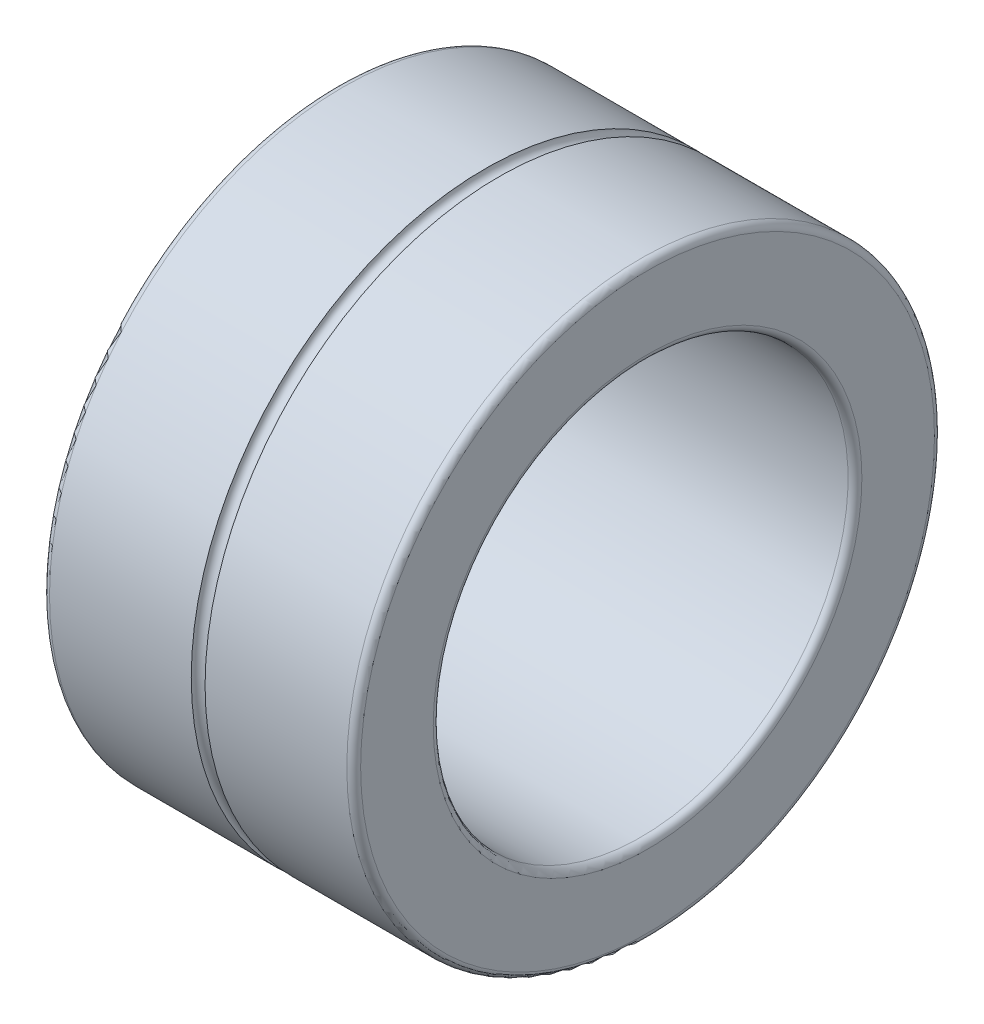
ISO-10303-21;
HEADER;
FILE_DESCRIPTION(('STEP AP214'),'2;1');
FILE_NAME('part.step','',(''),(''),'','','');
FILE_SCHEMA(('AUTOMOTIVE_DESIGN { 1 0 10303 214 1 1 1 1 }'));
ENDSEC;
DATA;
#1=APPLICATION_CONTEXT('core data for automotive mechanical design processes');
#2=APPLICATION_PROTOCOL_DEFINITION('international standard','automotive_design',2000,#1);
#3=PRODUCT_CONTEXT('',#1,'mechanical');
#4=PRODUCT('Part','Part','',(#3));
#5=PRODUCT_RELATED_PRODUCT_CATEGORY('part','',(#4));
#6=PRODUCT_DEFINITION_FORMATION('','',#4);
#7=PRODUCT_DEFINITION_CONTEXT('part definition',#1,'design');
#8=PRODUCT_DEFINITION('design','',#6,#7);
#9=PRODUCT_DEFINITION_SHAPE('','',#8);
#10=(LENGTH_UNIT() NAMED_UNIT(*) SI_UNIT(.MILLI.,.METRE.));
#11=(NAMED_UNIT(*) PLANE_ANGLE_UNIT() SI_UNIT($,.RADIAN.));
#12=(NAMED_UNIT(*) SI_UNIT($,.STERADIAN.) SOLID_ANGLE_UNIT());
#13=UNCERTAINTY_MEASURE_WITH_UNIT(LENGTH_MEASURE(1.E-05),#10,'distance_accuracy_value','');
#14=(GEOMETRIC_REPRESENTATION_CONTEXT(3) GLOBAL_UNCERTAINTY_ASSIGNED_CONTEXT((#13)) GLOBAL_UNIT_ASSIGNED_CONTEXT((#10,
#11,#12)) REPRESENTATION_CONTEXT('',''));
#15=CARTESIAN_POINT('',(0.,0.,0.));
#16=DIRECTION('',(0.,0.,1.));
#17=DIRECTION('',(1.,0.,0.));
#18=AXIS2_PLACEMENT_3D('',#15,#16,#17);
#19=CARTESIAN_POINT('',(0.,0.,0.));
#20=DIRECTION('',(-1.,0.,0.));
#21=DIRECTION('',(0.,0.,1.));
#22=AXIS2_PLACEMENT_3D('',#19,#20,#21);
#23=CYLINDRICAL_SURFACE('',#22,30.);
#24=CARTESIAN_POINT('',(1.,0.,0.));
#25=DIRECTION('',(1.,0.,0.));
#26=DIRECTION('',(0.,0.,-1.));
#27=AXIS2_PLACEMENT_3D('',#24,#25,#26);
#28=CIRCLE('',#27,30.);
#29=CARTESIAN_POINT('',(1.,0.,-30.));
#30=VERTEX_POINT('',#29);
#31=EDGE_CURVE('E57',#30,#30,#28,.F.);
#32=ORIENTED_EDGE('',*,*,#31,.T.);
#33=EDGE_LOOP('',(#32));
#34=FACE_BOUND('',#33,.T.);
#35=CARTESIAN_POINT('',(44.,0.,0.));
#36=DIRECTION('',(-1.,0.,0.));
#37=DIRECTION('',(0.,0.,1.));
#38=AXIS2_PLACEMENT_3D('',#35,#36,#37);
#39=CIRCLE('',#38,30.);
#40=CARTESIAN_POINT('',(44.,0.,30.));
#41=VERTEX_POINT('',#40);
#42=EDGE_CURVE('E60',#41,#41,#39,.F.);
#43=ORIENTED_EDGE('',*,*,#42,.T.);
#44=EDGE_LOOP('',(#43));
#45=FACE_BOUND('',#44,.T.);
#46=ADVANCED_FACE('F31',(#34,#45),#23,.F.);
#47=CARTESIAN_POINT('',(45.,42.5,0.));
#48=DIRECTION('',(-1.,0.,0.));
#49=DIRECTION('',(0.,0.,1.));
#50=AXIS2_PLACEMENT_3D('',#47,#48,#49);
#51=PLANE('',#50);
#52=CARTESIAN_POINT('',(45.,0.,0.));
#53=DIRECTION('',(-1.,0.,0.));
#54=DIRECTION('',(0.,0.,1.));
#55=AXIS2_PLACEMENT_3D('',#52,#53,#54);
#56=CIRCLE('',#55,41.5);
#57=CARTESIAN_POINT('',(45.,0.,41.5));
#58=VERTEX_POINT('',#57);
#59=EDGE_CURVE('E10',#58,#58,#56,.F.);
#60=ORIENTED_EDGE('',*,*,#59,.T.);
#61=EDGE_LOOP('',(#60));
#62=FACE_BOUND('',#61,.T.);
#63=CARTESIAN_POINT('',(45.,0.,0.));
#64=DIRECTION('',(-1.,0.,0.));
#65=DIRECTION('',(0.,0.,1.));
#66=AXIS2_PLACEMENT_3D('',#63,#64,#65);
#67=CIRCLE('',#66,31.);
#68=CARTESIAN_POINT('',(45.,0.,31.));
#69=VERTEX_POINT('',#68);
#70=EDGE_CURVE('E38',#69,#69,#67,.T.);
#71=ORIENTED_EDGE('',*,*,#70,.T.);
#72=EDGE_LOOP('',(#71));
#73=FACE_BOUND('',#72,.T.);
#74=ADVANCED_FACE('F80',(#62,#73),#51,.F.);
#75=CARTESIAN_POINT('',(0.,0.,0.));
#76=DIRECTION('',(-1.,0.,0.));
#77=DIRECTION('',(0.,0.,1.));
#78=AXIS2_PLACEMENT_3D('',#75,#76,#77);
#79=CYLINDRICAL_SURFACE('',#78,42.5);
#80=CARTESIAN_POINT('',(44.,0.,0.));
#81=DIRECTION('',(-1.,0.,0.));
#82=DIRECTION('',(0.,0.,1.));
#83=AXIS2_PLACEMENT_3D('',#80,#81,#82);
#84=CIRCLE('',#83,42.5);
#85=CARTESIAN_POINT('',(44.,0.,42.5));
#86=VERTEX_POINT('',#85);
#87=EDGE_CURVE('E42',#86,#86,#84,.T.);
#88=ORIENTED_EDGE('',*,*,#87,.T.);
#89=EDGE_LOOP('',(#88));
#90=FACE_BOUND('',#89,.T.);
#91=CARTESIAN_POINT('',(23.5,0.,0.));
#92=DIRECTION('',(-1.,0.,0.));
#93=DIRECTION('',(0.,0.,1.));
#94=AXIS2_PLACEMENT_3D('',#91,#92,#93);
#95=CIRCLE('',#94,42.5);
#96=CARTESIAN_POINT('',(23.5,0.,42.5));
#97=VERTEX_POINT('',#96);
#98=EDGE_CURVE('E63',#97,#97,#95,.T.);
#99=ORIENTED_EDGE('',*,*,#98,.F.);
#100=EDGE_LOOP('',(#99));
#101=FACE_BOUND('',#100,.T.);
#102=ADVANCED_FACE('F75',(#90,#101),#79,.T.);
#103=CARTESIAN_POINT('',(22.5,0.,0.));
#104=DIRECTION('',(-1.,0.,0.));
#105=DIRECTION('',(0.,0.,1.));
#106=AXIS2_PLACEMENT_3D('',#103,#104,#105);
#107=TOROIDAL_SURFACE('',#106,42.5,1.);
#108=CARTESIAN_POINT('',(21.5,0.,0.));
#109=DIRECTION('',(-1.,0.,0.));
#110=DIRECTION('',(0.,0.,1.));
#111=AXIS2_PLACEMENT_3D('',#108,#109,#110);
#112=CIRCLE('',#111,42.5);
#113=CARTESIAN_POINT('',(21.5,0.,42.5));
#114=VERTEX_POINT('',#113);
#115=EDGE_CURVE('E66',#114,#114,#112,.T.);
#116=ORIENTED_EDGE('',*,*,#115,.F.);
#117=EDGE_LOOP('',(#116));
#118=FACE_BOUND('',#117,.T.);
#119=ORIENTED_EDGE('',*,*,#98,.T.);
#120=EDGE_LOOP('',(#119));
#121=FACE_BOUND('',#120,.T.);
#122=ADVANCED_FACE('F72',(#118,#121),#107,.F.);
#123=CARTESIAN_POINT('',(0.,0.,0.));
#124=DIRECTION('',(-1.,0.,0.));
#125=DIRECTION('',(0.,0.,1.));
#126=AXIS2_PLACEMENT_3D('',#123,#124,#125);
#127=CYLINDRICAL_SURFACE('',#126,42.5);
#128=CARTESIAN_POINT('',(1.,0.,0.));
#129=DIRECTION('',(1.,0.,0.));
#130=DIRECTION('',(0.,0.,-1.));
#131=AXIS2_PLACEMENT_3D('',#128,#129,#130);
#132=CIRCLE('',#131,42.5);
#133=CARTESIAN_POINT('',(1.,0.,-42.5));
#134=VERTEX_POINT('',#133);
#135=EDGE_CURVE('E46',#134,#134,#132,.T.);
#136=ORIENTED_EDGE('',*,*,#135,.T.);
#137=EDGE_LOOP('',(#136));
#138=FACE_BOUND('',#137,.T.);
#139=ORIENTED_EDGE('',*,*,#115,.T.);
#140=EDGE_LOOP('',(#139));
#141=FACE_BOUND('',#140,.T.);
#142=ADVANCED_FACE('F70',(#138,#141),#127,.T.);
#143=CARTESIAN_POINT('',(0.,30.,0.));
#144=DIRECTION('',(1.,0.,0.));
#145=DIRECTION('',(0.,0.,-1.));
#146=AXIS2_PLACEMENT_3D('',#143,#144,#145);
#147=PLANE('',#146);
#148=CARTESIAN_POINT('',(0.,0.,0.));
#149=DIRECTION('',(1.,0.,0.));
#150=DIRECTION('',(0.,0.,-1.));
#151=AXIS2_PLACEMENT_3D('',#148,#149,#150);
#152=CIRCLE('',#151,31.);
#153=CARTESIAN_POINT('',(0.,0.,-31.));
#154=VERTEX_POINT('',#153);
#155=EDGE_CURVE('E51',#154,#154,#152,.T.);
#156=ORIENTED_EDGE('',*,*,#155,.T.);
#157=EDGE_LOOP('',(#156));
#158=FACE_BOUND('',#157,.T.);
#159=CARTESIAN_POINT('',(0.,0.,0.));
#160=DIRECTION('',(1.,0.,0.));
#161=DIRECTION('',(0.,0.,-1.));
#162=AXIS2_PLACEMENT_3D('',#159,#160,#161);
#163=CIRCLE('',#162,41.5);
#164=CARTESIAN_POINT('',(0.,0.,-41.5));
#165=VERTEX_POINT('',#164);
#166=EDGE_CURVE('E54',#165,#165,#163,.F.);
#167=ORIENTED_EDGE('',*,*,#166,.T.);
#168=EDGE_LOOP('',(#167));
#169=FACE_BOUND('',#168,.T.);
#170=ADVANCED_FACE('F98',(#158,#169),#147,.F.);
#171=CARTESIAN_POINT('',(1.,0.,0.));
#172=DIRECTION('',(1.,0.,0.));
#173=DIRECTION('',(0.,0.,-1.));
#174=AXIS2_PLACEMENT_3D('',#171,#172,#173);
#175=TOROIDAL_SURFACE('',#174,31.,1.);
#176=ORIENTED_EDGE('',*,*,#155,.F.);
#177=EDGE_LOOP('',(#176));
#178=FACE_BOUND('',#177,.T.);
#179=ORIENTED_EDGE('',*,*,#31,.F.);
#180=EDGE_LOOP('',(#179));
#181=FACE_BOUND('',#180,.T.);
#182=ADVANCED_FACE('F94',(#178,#181),#175,.T.);
#183=CARTESIAN_POINT('',(1.,0.,0.));
#184=DIRECTION('',(1.,0.,0.));
#185=DIRECTION('',(0.,0.,-1.));
#186=AXIS2_PLACEMENT_3D('',#183,#184,#185);
#187=TOROIDAL_SURFACE('',#186,41.5,1.);
#188=ORIENTED_EDGE('',*,*,#135,.F.);
#189=EDGE_LOOP('',(#188));
#190=FACE_BOUND('',#189,.T.);
#191=ORIENTED_EDGE('',*,*,#166,.F.);
#192=EDGE_LOOP('',(#191));
#193=FACE_BOUND('',#192,.T.);
#194=ADVANCED_FACE('F97',(#190,#193),#187,.T.);
#195=CARTESIAN_POINT('',(44.,0.,0.));
#196=DIRECTION('',(-1.,0.,0.));
#197=DIRECTION('',(0.,0.,1.));
#198=AXIS2_PLACEMENT_3D('',#195,#196,#197);
#199=TOROIDAL_SURFACE('',#198,41.5,1.);
#200=ORIENTED_EDGE('',*,*,#59,.F.);
#201=EDGE_LOOP('',(#200));
#202=FACE_BOUND('',#201,.T.);
#203=ORIENTED_EDGE('',*,*,#87,.F.);
#204=EDGE_LOOP('',(#203));
#205=FACE_BOUND('',#204,.T.);
#206=ADVANCED_FACE('F101',(#202,#205),#199,.T.);
#207=CARTESIAN_POINT('',(44.,0.,0.));
#208=DIRECTION('',(-1.,0.,0.));
#209=DIRECTION('',(0.,0.,1.));
#210=AXIS2_PLACEMENT_3D('',#207,#208,#209);
#211=TOROIDAL_SURFACE('',#210,31.,1.);
#212=ORIENTED_EDGE('',*,*,#42,.F.);
#213=EDGE_LOOP('',(#212));
#214=FACE_BOUND('',#213,.T.);
#215=ORIENTED_EDGE('',*,*,#70,.F.);
#216=EDGE_LOOP('',(#215));
#217=FACE_BOUND('',#216,.T.);
#218=ADVANCED_FACE('F33',(#214,#217),#211,.T.);
#219=CLOSED_SHELL('',(#46,#74,#102,#122,#142,#170,#182,#194,#206,#218));
#220=MANIFOLD_SOLID_BREP('B2',#219);
#221=ADVANCED_BREP_SHAPE_REPRESENTATION('',(#18,#220),#14);
#222=SHAPE_DEFINITION_REPRESENTATION(#9,#221);
ENDSEC;
END-ISO-10303-21;
